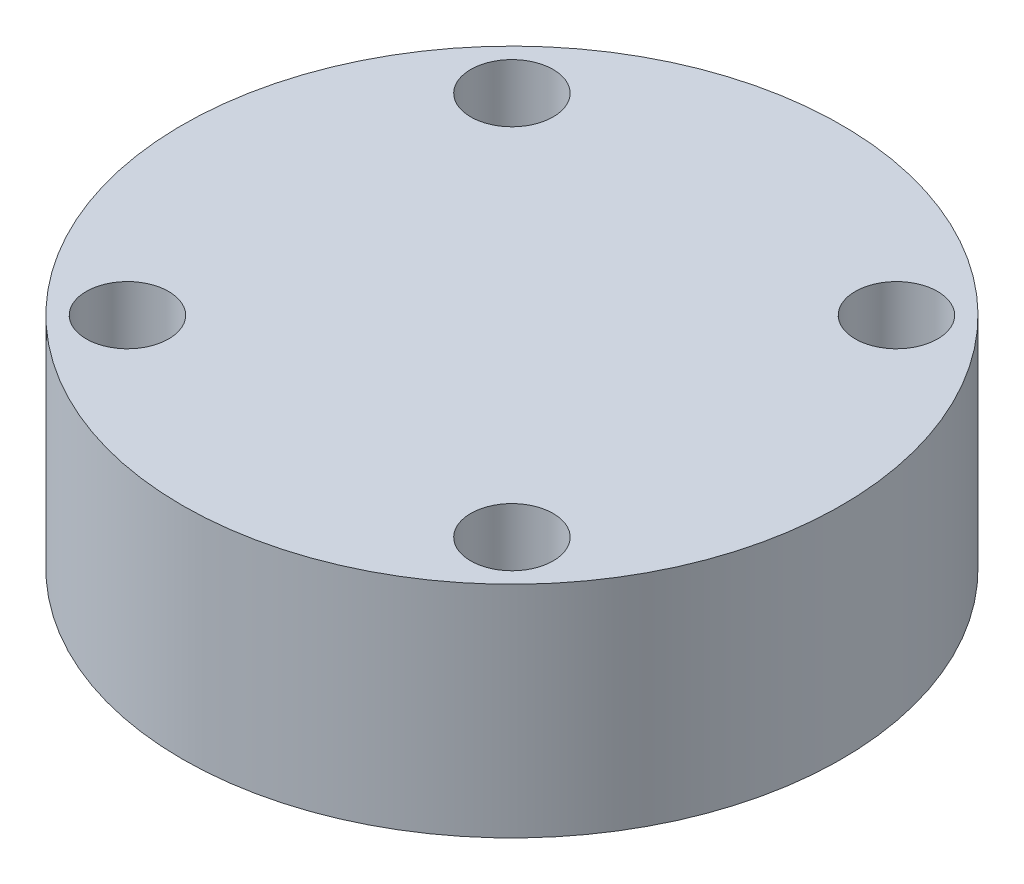
ISO-10303-21;
HEADER;
FILE_DESCRIPTION(('STEP AP214'),'2;1');
FILE_NAME('part.step','',(''),(''),'','','');
FILE_SCHEMA(('AUTOMOTIVE_DESIGN { 1 0 10303 214 1 1 1 1 }'));
ENDSEC;
DATA;
#1=APPLICATION_CONTEXT('core data for automotive mechanical design processes');
#2=APPLICATION_PROTOCOL_DEFINITION('international standard','automotive_design',2000,#1);
#3=PRODUCT_CONTEXT('',#1,'mechanical');
#4=PRODUCT('Part','Part','',(#3));
#5=PRODUCT_RELATED_PRODUCT_CATEGORY('part','',(#4));
#6=PRODUCT_DEFINITION_FORMATION('','',#4);
#7=PRODUCT_DEFINITION_CONTEXT('part definition',#1,'design');
#8=PRODUCT_DEFINITION('design','',#6,#7);
#9=PRODUCT_DEFINITION_SHAPE('','',#8);
#10=(LENGTH_UNIT() NAMED_UNIT(*) SI_UNIT(.MILLI.,.METRE.));
#11=(NAMED_UNIT(*) PLANE_ANGLE_UNIT() SI_UNIT($,.RADIAN.));
#12=(NAMED_UNIT(*) SI_UNIT($,.STERADIAN.) SOLID_ANGLE_UNIT());
#13=UNCERTAINTY_MEASURE_WITH_UNIT(LENGTH_MEASURE(1.E-05),#10,'distance_accuracy_value','');
#14=(GEOMETRIC_REPRESENTATION_CONTEXT(3) GLOBAL_UNCERTAINTY_ASSIGNED_CONTEXT((#13)) GLOBAL_UNIT_ASSIGNED_CONTEXT((#10,
#11,#12)) REPRESENTATION_CONTEXT('',''));
#15=CARTESIAN_POINT('',(0.,0.,0.));
#16=DIRECTION('',(0.,0.,1.));
#17=DIRECTION('',(1.,0.,0.));
#18=AXIS2_PLACEMENT_3D('',#15,#16,#17);
#19=CARTESIAN_POINT('',(0.,6.35,0.));
#20=DIRECTION('',(0.,1.,0.));
#21=DIRECTION('',(0.,0.,1.));
#22=AXIS2_PLACEMENT_3D('',#19,#20,#21);
#23=PLANE('',#22);
#24=CARTESIAN_POINT('',(-5.55625,6.35,5.55625));
#25=DIRECTION('',(0.,1.,0.));
#26=DIRECTION('',(0.,0.,1.));
#27=AXIS2_PLACEMENT_3D('',#24,#25,#26);
#28=CIRCLE('',#27,1.190625);
#29=CARTESIAN_POINT('',(-5.55625,6.35,6.746875));
#30=VERTEX_POINT('',#29);
#31=EDGE_CURVE('E64',#30,#30,#28,.T.);
#32=ORIENTED_EDGE('',*,*,#31,.F.);
#33=EDGE_LOOP('',(#32));
#34=FACE_BOUND('',#33,.T.);
#35=CARTESIAN_POINT('',(5.55625,6.35,-5.55625));
#36=DIRECTION('',(0.,1.,0.));
#37=DIRECTION('',(0.,0.,1.));
#38=AXIS2_PLACEMENT_3D('',#35,#36,#37);
#39=CIRCLE('',#38,1.190625);
#40=CARTESIAN_POINT('',(5.55625,6.35,-4.365625));
#41=VERTEX_POINT('',#40);
#42=EDGE_CURVE('E50',#41,#41,#39,.T.);
#43=ORIENTED_EDGE('',*,*,#42,.F.);
#44=EDGE_LOOP('',(#43));
#45=FACE_BOUND('',#44,.T.);
#46=CARTESIAN_POINT('',(0.,6.35,0.));
#47=DIRECTION('',(0.,1.,0.));
#48=DIRECTION('',(0.,0.,1.));
#49=AXIS2_PLACEMENT_3D('',#46,#47,#48);
#50=CIRCLE('',#49,9.525);
#51=CARTESIAN_POINT('',(0.,6.35,9.525));
#52=VERTEX_POINT('',#51);
#53=EDGE_CURVE('E10',#52,#52,#50,.T.);
#54=ORIENTED_EDGE('',*,*,#53,.T.);
#55=EDGE_LOOP('',(#54));
#56=FACE_BOUND('',#55,.T.);
#57=CARTESIAN_POINT('',(5.55625,6.35,5.55625));
#58=DIRECTION('',(0.,1.,0.));
#59=DIRECTION('',(0.,0.,-1.));
#60=AXIS2_PLACEMENT_3D('',#57,#58,#59);
#61=CIRCLE('',#60,1.190625);
#62=CARTESIAN_POINT('',(5.55625,6.35,4.365625));
#63=VERTEX_POINT('',#62);
#64=EDGE_CURVE('E56',#63,#63,#61,.T.);
#65=ORIENTED_EDGE('',*,*,#64,.F.);
#66=EDGE_LOOP('',(#65));
#67=FACE_BOUND('',#66,.T.);
#68=CARTESIAN_POINT('',(-5.55625,6.35,-5.55625));
#69=DIRECTION('',(0.,1.,0.));
#70=DIRECTION('',(0.,0.,-1.));
#71=AXIS2_PLACEMENT_3D('',#68,#69,#70);
#72=CIRCLE('',#71,1.190625);
#73=CARTESIAN_POINT('',(-5.55625,6.35,-6.746875));
#74=VERTEX_POINT('',#73);
#75=EDGE_CURVE('E72',#74,#74,#72,.T.);
#76=ORIENTED_EDGE('',*,*,#75,.F.);
#77=EDGE_LOOP('',(#76));
#78=FACE_BOUND('',#77,.T.);
#79=ADVANCED_FACE('F37',(#34,#45,#56,#67,#78),#23,.T.);
#80=CARTESIAN_POINT('',(0.,0.,0.));
#81=DIRECTION('',(0.,1.,0.));
#82=DIRECTION('',(0.,0.,1.));
#83=AXIS2_PLACEMENT_3D('',#80,#81,#82);
#84=PLANE('',#83);
#85=CARTESIAN_POINT('',(0.,0.,0.));
#86=DIRECTION('',(0.,1.,0.));
#87=DIRECTION('',(0.,0.,1.));
#88=AXIS2_PLACEMENT_3D('',#85,#86,#87);
#89=CIRCLE('',#88,9.525);
#90=CARTESIAN_POINT('',(0.,0.,9.525));
#91=VERTEX_POINT('',#90);
#92=EDGE_CURVE('E41',#91,#91,#89,.T.);
#93=ORIENTED_EDGE('',*,*,#92,.F.);
#94=EDGE_LOOP('',(#93));
#95=FACE_BOUND('',#94,.T.);
#96=CARTESIAN_POINT('',(5.55625,0.,-5.55625));
#97=DIRECTION('',(0.,1.,0.));
#98=DIRECTION('',(0.,0.,1.));
#99=AXIS2_PLACEMENT_3D('',#96,#97,#98);
#100=CIRCLE('',#99,1.190625);
#101=CARTESIAN_POINT('',(5.55625,0.,-4.365625));
#102=VERTEX_POINT('',#101);
#103=EDGE_CURVE('E52',#102,#102,#100,.T.);
#104=ORIENTED_EDGE('',*,*,#103,.T.);
#105=EDGE_LOOP('',(#104));
#106=FACE_BOUND('',#105,.T.);
#107=CARTESIAN_POINT('',(5.55625,0.,5.55625));
#108=DIRECTION('',(0.,1.,0.));
#109=DIRECTION('',(0.,0.,-1.));
#110=AXIS2_PLACEMENT_3D('',#107,#108,#109);
#111=CIRCLE('',#110,1.190625);
#112=CARTESIAN_POINT('',(5.55625,0.,4.365625));
#113=VERTEX_POINT('',#112);
#114=EDGE_CURVE('E60',#113,#113,#111,.T.);
#115=ORIENTED_EDGE('',*,*,#114,.T.);
#116=EDGE_LOOP('',(#115));
#117=FACE_BOUND('',#116,.T.);
#118=CARTESIAN_POINT('',(-5.55625,0.,5.55625));
#119=DIRECTION('',(0.,1.,0.));
#120=DIRECTION('',(0.,0.,1.));
#121=AXIS2_PLACEMENT_3D('',#118,#119,#120);
#122=CIRCLE('',#121,1.190625);
#123=CARTESIAN_POINT('',(-5.55625,0.,6.746875));
#124=VERTEX_POINT('',#123);
#125=EDGE_CURVE('E68',#124,#124,#122,.T.);
#126=ORIENTED_EDGE('',*,*,#125,.T.);
#127=EDGE_LOOP('',(#126));
#128=FACE_BOUND('',#127,.T.);
#129=CARTESIAN_POINT('',(-5.55625,0.,-5.55625));
#130=DIRECTION('',(0.,1.,0.));
#131=DIRECTION('',(0.,0.,-1.));
#132=AXIS2_PLACEMENT_3D('',#129,#130,#131);
#133=CIRCLE('',#132,1.190625);
#134=CARTESIAN_POINT('',(-5.55625,0.,-6.746875));
#135=VERTEX_POINT('',#134);
#136=EDGE_CURVE('E76',#135,#135,#133,.T.);
#137=ORIENTED_EDGE('',*,*,#136,.T.);
#138=EDGE_LOOP('',(#137));
#139=FACE_BOUND('',#138,.T.);
#140=ADVANCED_FACE('F88',(#95,#106,#117,#128,#139),#84,.F.);
#141=CARTESIAN_POINT('',(0.,6.35,0.));
#142=DIRECTION('',(0.,-1.,0.));
#143=DIRECTION('',(0.,0.,-1.));
#144=AXIS2_PLACEMENT_3D('',#141,#142,#143);
#145=CYLINDRICAL_SURFACE('',#144,9.525);
#146=ORIENTED_EDGE('',*,*,#53,.F.);
#147=EDGE_LOOP('',(#146));
#148=FACE_BOUND('',#147,.T.);
#149=ORIENTED_EDGE('',*,*,#92,.T.);
#150=EDGE_LOOP('',(#149));
#151=FACE_BOUND('',#150,.T.);
#152=ADVANCED_FACE('F39',(#148,#151),#145,.T.);
#153=CARTESIAN_POINT('',(5.55625,6.35,-5.55625));
#154=DIRECTION('',(0.,-1.,0.));
#155=DIRECTION('',(0.,0.,-1.));
#156=AXIS2_PLACEMENT_3D('',#153,#154,#155);
#157=CYLINDRICAL_SURFACE('',#156,1.190625);
#158=ORIENTED_EDGE('',*,*,#42,.T.);
#159=EDGE_LOOP('',(#158));
#160=FACE_BOUND('',#159,.T.);
#161=ORIENTED_EDGE('',*,*,#103,.F.);
#162=EDGE_LOOP('',(#161));
#163=FACE_BOUND('',#162,.T.);
#164=ADVANCED_FACE('F98',(#160,#163),#157,.F.);
#165=CARTESIAN_POINT('',(5.55625,6.35,5.55625));
#166=DIRECTION('',(0.,-1.,0.));
#167=DIRECTION('',(0.,0.,-1.));
#168=AXIS2_PLACEMENT_3D('',#165,#166,#167);
#169=CYLINDRICAL_SURFACE('',#168,1.190625);
#170=ORIENTED_EDGE('',*,*,#64,.T.);
#171=EDGE_LOOP('',(#170));
#172=FACE_BOUND('',#171,.T.);
#173=ORIENTED_EDGE('',*,*,#114,.F.);
#174=EDGE_LOOP('',(#173));
#175=FACE_BOUND('',#174,.T.);
#176=ADVANCED_FACE('F101',(#172,#175),#169,.F.);
#177=CARTESIAN_POINT('',(-5.55625,6.35,5.55625));
#178=DIRECTION('',(0.,-1.,0.));
#179=DIRECTION('',(0.,0.,-1.));
#180=AXIS2_PLACEMENT_3D('',#177,#178,#179);
#181=CYLINDRICAL_SURFACE('',#180,1.190625);
#182=ORIENTED_EDGE('',*,*,#31,.T.);
#183=EDGE_LOOP('',(#182));
#184=FACE_BOUND('',#183,.T.);
#185=ORIENTED_EDGE('',*,*,#125,.F.);
#186=EDGE_LOOP('',(#185));
#187=FACE_BOUND('',#186,.T.);
#188=ADVANCED_FACE('F105',(#184,#187),#181,.F.);
#189=CARTESIAN_POINT('',(-5.55625,6.35,-5.55625));
#190=DIRECTION('',(0.,-1.,0.));
#191=DIRECTION('',(0.,0.,-1.));
#192=AXIS2_PLACEMENT_3D('',#189,#190,#191);
#193=CYLINDRICAL_SURFACE('',#192,1.190625);
#194=ORIENTED_EDGE('',*,*,#75,.T.);
#195=EDGE_LOOP('',(#194));
#196=FACE_BOUND('',#195,.T.);
#197=ORIENTED_EDGE('',*,*,#136,.F.);
#198=EDGE_LOOP('',(#197));
#199=FACE_BOUND('',#198,.T.);
#200=ADVANCED_FACE('F84',(#196,#199),#193,.F.);
#201=CLOSED_SHELL('',(#79,#140,#152,#164,#176,#188,#200));
#202=MANIFOLD_SOLID_BREP('B2',#201);
#203=ADVANCED_BREP_SHAPE_REPRESENTATION('',(#18,#202),#14);
#204=SHAPE_DEFINITION_REPRESENTATION(#9,#203);
ENDSEC;
END-ISO-10303-21;
